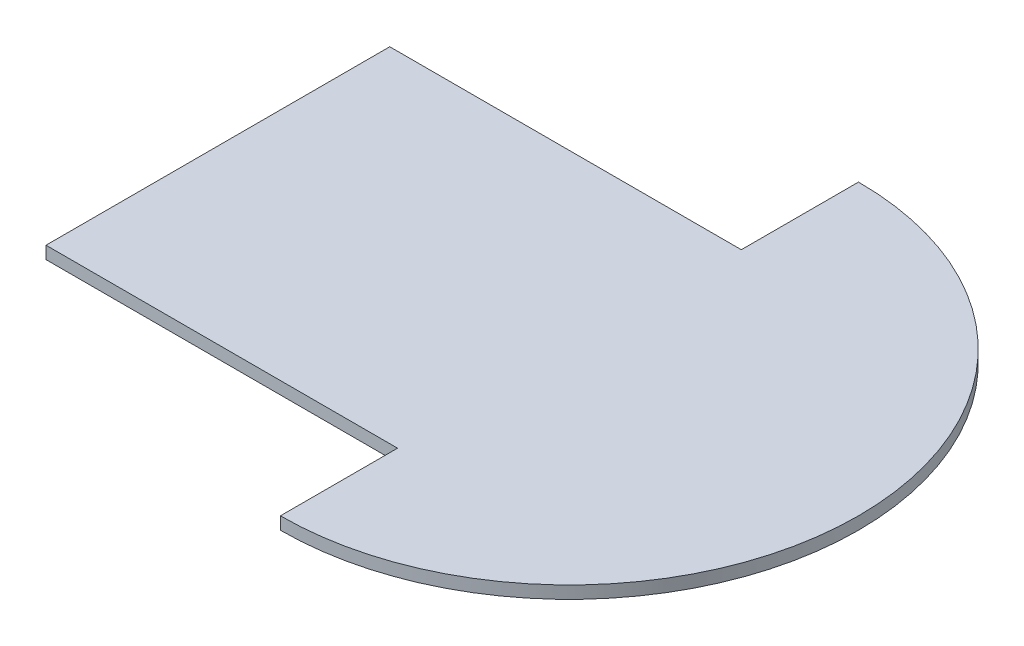
ISO-10303-21;
HEADER;
FILE_DESCRIPTION(('STEP AP214'),'2;1');
FILE_NAME('part.step','',(''),(''),'','','');
FILE_SCHEMA(('AUTOMOTIVE_DESIGN { 1 0 10303 214 1 1 1 1 }'));
ENDSEC;
DATA;
#1=APPLICATION_CONTEXT('core data for automotive mechanical design processes');
#2=APPLICATION_PROTOCOL_DEFINITION('international standard','automotive_design',2000,#1);
#3=PRODUCT_CONTEXT('',#1,'mechanical');
#4=PRODUCT('Part','Part','',(#3));
#5=PRODUCT_RELATED_PRODUCT_CATEGORY('part','',(#4));
#6=PRODUCT_DEFINITION_FORMATION('','',#4);
#7=PRODUCT_DEFINITION_CONTEXT('part definition',#1,'design');
#8=PRODUCT_DEFINITION('design','',#6,#7);
#9=PRODUCT_DEFINITION_SHAPE('','',#8);
#10=(LENGTH_UNIT() NAMED_UNIT(*) SI_UNIT(.MILLI.,.METRE.));
#11=(NAMED_UNIT(*) PLANE_ANGLE_UNIT() SI_UNIT($,.RADIAN.));
#12=(NAMED_UNIT(*) SI_UNIT($,.STERADIAN.) SOLID_ANGLE_UNIT());
#13=UNCERTAINTY_MEASURE_WITH_UNIT(LENGTH_MEASURE(1.E-05),#10,'distance_accuracy_value','');
#14=(GEOMETRIC_REPRESENTATION_CONTEXT(3) GLOBAL_UNCERTAINTY_ASSIGNED_CONTEXT((#13)) GLOBAL_UNIT_ASSIGNED_CONTEXT((#10,
#11,#12)) REPRESENTATION_CONTEXT('',''));
#15=CARTESIAN_POINT('',(0.,0.,0.));
#16=DIRECTION('',(0.,0.,1.));
#17=DIRECTION('',(1.,0.,0.));
#18=AXIS2_PLACEMENT_3D('',#15,#16,#17);
#19=CARTESIAN_POINT('',(-81.7186966651467,1.6,-33.036003586062));
#20=DIRECTION('',(0.,0.,1.));
#21=DIRECTION('',(1.,0.,0.));
#22=AXIS2_PLACEMENT_3D('',#19,#20,#21);
#23=PLANE('',#22);
#24=DIRECTION('',(-1.,0.,0.));
#25=VECTOR('',#24,1.);
#26=CARTESIAN_POINT('',(-81.7186966651467,0.,-33.036003586062));
#27=LINE('',#26,#25);
#28=CARTESIAN_POINT('',(-36.7186966651467,0.,-33.036003586062));
#29=VERTEX_POINT('',#28);
#30=CARTESIAN_POINT('',(-81.7186966651467,0.,-33.036003586062));
#31=VERTEX_POINT('',#30);
#32=EDGE_CURVE('E122',#29,#31,#27,.T.);
#33=ORIENTED_EDGE('',*,*,#32,.T.);
#34=DIRECTION('',(0.,-1.,0.));
#35=VECTOR('',#34,1.);
#36=CARTESIAN_POINT('',(-81.7186966651467,1.6,-33.036003586062));
#37=LINE('',#36,#35);
#38=CARTESIAN_POINT('',(-81.7186966651467,1.6,-33.036003586062));
#39=VERTEX_POINT('',#38);
#40=EDGE_CURVE('E11',#39,#31,#37,.T.);
#41=ORIENTED_EDGE('',*,*,#40,.F.);
#42=DIRECTION('',(-1.,0.,0.));
#43=VECTOR('',#42,1.);
#44=CARTESIAN_POINT('',(-81.7186966651467,1.6,-33.036003586062));
#45=LINE('',#44,#43);
#46=CARTESIAN_POINT('',(-36.7186966651467,1.6,-33.036003586062));
#47=VERTEX_POINT('',#46);
#48=EDGE_CURVE('E132',#47,#39,#45,.T.);
#49=ORIENTED_EDGE('',*,*,#48,.F.);
#50=DIRECTION('',(0.,-1.,0.));
#51=VECTOR('',#50,1.);
#52=CARTESIAN_POINT('',(-36.7186966651467,1.6,-33.036003586062));
#53=LINE('',#52,#51);
#54=EDGE_CURVE('E118',#47,#29,#53,.T.);
#55=ORIENTED_EDGE('',*,*,#54,.T.);
#56=EDGE_LOOP('',(#33,#41,#49,#55));
#57=FACE_BOUND('',#56,.T.);
#58=ADVANCED_FACE('F38',(#57),#23,.F.);
#59=CARTESIAN_POINT('',(-81.7186966651467,1.6,-33.036003586062));
#60=DIRECTION('',(1.,0.,0.));
#61=DIRECTION('',(0.,0.,-1.));
#62=AXIS2_PLACEMENT_3D('',#59,#60,#61);
#63=PLANE('',#62);
#64=DIRECTION('',(0.,0.,1.));
#65=VECTOR('',#64,1.);
#66=CARTESIAN_POINT('',(-81.7186966651467,0.,-33.036003586062));
#67=LINE('',#66,#65);
#68=CARTESIAN_POINT('',(-81.7186966651467,0.,10.963996413938));
#69=VERTEX_POINT('',#68);
#70=EDGE_CURVE('E125',#31,#69,#67,.T.);
#71=ORIENTED_EDGE('',*,*,#70,.T.);
#72=DIRECTION('',(0.,-1.,0.));
#73=VECTOR('',#72,1.);
#74=CARTESIAN_POINT('',(-81.7186966651467,1.6,10.963996413938));
#75=LINE('',#74,#73);
#76=CARTESIAN_POINT('',(-81.7186966651467,1.6,10.963996413938));
#77=VERTEX_POINT('',#76);
#78=EDGE_CURVE('E46',#77,#69,#75,.T.);
#79=ORIENTED_EDGE('',*,*,#78,.F.);
#80=DIRECTION('',(0.,0.,1.));
#81=VECTOR('',#80,1.);
#82=CARTESIAN_POINT('',(-81.7186966651467,1.6,-33.036003586062));
#83=LINE('',#82,#81);
#84=EDGE_CURVE('E91',#39,#77,#83,.T.);
#85=ORIENTED_EDGE('',*,*,#84,.F.);
#86=ORIENTED_EDGE('',*,*,#40,.T.);
#87=EDGE_LOOP('',(#71,#79,#85,#86));
#88=FACE_BOUND('',#87,.T.);
#89=ADVANCED_FACE('F156',(#88),#63,.F.);
#90=CARTESIAN_POINT('',(-81.7186966651467,1.6,10.963996413938));
#91=DIRECTION('',(0.,0.,-1.));
#92=DIRECTION('',(-1.,0.,0.));
#93=AXIS2_PLACEMENT_3D('',#90,#91,#92);
#94=PLANE('',#93);
#95=DIRECTION('',(1.,0.,0.));
#96=VECTOR('',#95,1.);
#97=CARTESIAN_POINT('',(-81.7186966651467,0.,10.963996413938));
#98=LINE('',#97,#96);
#99=CARTESIAN_POINT('',(-36.7186966651467,0.,10.963996413938));
#100=VERTEX_POINT('',#99);
#101=EDGE_CURVE('E127',#69,#100,#98,.T.);
#102=ORIENTED_EDGE('',*,*,#101,.T.);
#103=DIRECTION('',(0.,-1.,0.));
#104=VECTOR('',#103,1.);
#105=CARTESIAN_POINT('',(-36.7186966651467,1.6,10.963996413938));
#106=LINE('',#105,#104);
#107=CARTESIAN_POINT('',(-36.7186966651467,1.6,10.963996413938));
#108=VERTEX_POINT('',#107);
#109=EDGE_CURVE('E113',#108,#100,#106,.T.);
#110=ORIENTED_EDGE('',*,*,#109,.F.);
#111=DIRECTION('',(1.,0.,0.));
#112=VECTOR('',#111,1.);
#113=CARTESIAN_POINT('',(-81.7186966651467,1.6,10.963996413938));
#114=LINE('',#113,#112);
#115=EDGE_CURVE('E104',#77,#108,#114,.T.);
#116=ORIENTED_EDGE('',*,*,#115,.F.);
#117=ORIENTED_EDGE('',*,*,#78,.T.);
#118=EDGE_LOOP('',(#102,#110,#116,#117));
#119=FACE_BOUND('',#118,.T.);
#120=ADVANCED_FACE('F138',(#119),#94,.F.);
#121=CARTESIAN_POINT('',(-36.7186966651467,1.6,10.963996413938));
#122=DIRECTION('',(1.,0.,0.));
#123=DIRECTION('',(0.,0.,-1.));
#124=AXIS2_PLACEMENT_3D('',#121,#122,#123);
#125=PLANE('',#124);
#126=DIRECTION('',(0.,0.,1.));
#127=VECTOR('',#126,1.);
#128=CARTESIAN_POINT('',(-36.7186966651467,0.,10.963996413938));
#129=LINE('',#128,#127);
#130=CARTESIAN_POINT('',(-36.7186966651467,0.,25.963996413938));
#131=VERTEX_POINT('',#130);
#132=EDGE_CURVE('E112',#100,#131,#129,.T.);
#133=ORIENTED_EDGE('',*,*,#132,.T.);
#134=DIRECTION('',(0.,-1.,0.));
#135=VECTOR('',#134,1.);
#136=CARTESIAN_POINT('',(-36.7186966651467,1.6,25.963996413938));
#137=LINE('',#136,#135);
#138=CARTESIAN_POINT('',(-36.7186966651467,1.6,25.963996413938));
#139=VERTEX_POINT('',#138);
#140=EDGE_CURVE('E109',#139,#131,#137,.T.);
#141=ORIENTED_EDGE('',*,*,#140,.F.);
#142=DIRECTION('',(0.,0.,1.));
#143=VECTOR('',#142,1.);
#144=CARTESIAN_POINT('',(-36.7186966651467,1.6,10.963996413938));
#145=LINE('',#144,#143);
#146=EDGE_CURVE('E98',#108,#139,#145,.T.);
#147=ORIENTED_EDGE('',*,*,#146,.F.);
#148=ORIENTED_EDGE('',*,*,#109,.T.);
#149=EDGE_LOOP('',(#133,#141,#147,#148));
#150=FACE_BOUND('',#149,.T.);
#151=ADVANCED_FACE('F110',(#150),#125,.F.);
#152=CARTESIAN_POINT('',(-36.7186966651467,1.6,-11.036003586062));
#153=DIRECTION('',(0.,-1.,0.));
#154=DIRECTION('',(0.,0.,-1.));
#155=AXIS2_PLACEMENT_3D('',#152,#153,#154);
#156=CYLINDRICAL_SURFACE('',#155,37.);
#157=CARTESIAN_POINT('',(-36.7186966651467,0.,-11.036003586062));
#158=DIRECTION('',(0.,1.,0.));
#159=DIRECTION('',(0.,0.,-1.));
#160=AXIS2_PLACEMENT_3D('',#157,#158,#159);
#161=CIRCLE('',#160,37.);
#162=CARTESIAN_POINT('',(-36.7186966651467,0.,-48.036003586062));
#163=VERTEX_POINT('',#162);
#164=EDGE_CURVE('E77',#131,#163,#161,.T.);
#165=ORIENTED_EDGE('',*,*,#164,.T.);
#166=DIRECTION('',(0.,-1.,0.));
#167=VECTOR('',#166,1.);
#168=CARTESIAN_POINT('',(-36.7186966651467,1.6,-48.036003586062));
#169=LINE('',#168,#167);
#170=CARTESIAN_POINT('',(-36.7186966651467,1.6,-48.036003586062));
#171=VERTEX_POINT('',#170);
#172=EDGE_CURVE('E114',#171,#163,#169,.T.);
#173=ORIENTED_EDGE('',*,*,#172,.F.);
#174=CARTESIAN_POINT('',(-36.7186966651467,1.6,-11.036003586062));
#175=DIRECTION('',(0.,1.,0.));
#176=DIRECTION('',(0.,0.,-1.));
#177=AXIS2_PLACEMENT_3D('',#174,#175,#176);
#178=CIRCLE('',#177,37.);
#179=EDGE_CURVE('E102',#139,#171,#178,.T.);
#180=ORIENTED_EDGE('',*,*,#179,.F.);
#181=ORIENTED_EDGE('',*,*,#140,.T.);
#182=EDGE_LOOP('',(#165,#173,#180,#181));
#183=FACE_BOUND('',#182,.T.);
#184=ADVANCED_FACE('F116',(#183),#156,.T.);
#185=CARTESIAN_POINT('',(-36.7186966651467,1.6,-33.036003586062));
#186=DIRECTION('',(1.,0.,0.));
#187=DIRECTION('',(0.,0.,-1.));
#188=AXIS2_PLACEMENT_3D('',#185,#186,#187);
#189=PLANE('',#188);
#190=DIRECTION('',(0.,0.,1.));
#191=VECTOR('',#190,1.);
#192=CARTESIAN_POINT('',(-36.7186966651467,0.,-33.036003586062));
#193=LINE('',#192,#191);
#194=EDGE_CURVE('E83',#163,#29,#193,.T.);
#195=ORIENTED_EDGE('',*,*,#194,.T.);
#196=ORIENTED_EDGE('',*,*,#54,.F.);
#197=DIRECTION('',(0.,0.,1.));
#198=VECTOR('',#197,1.);
#199=CARTESIAN_POINT('',(-36.7186966651467,1.6,-33.036003586062));
#200=LINE('',#199,#198);
#201=EDGE_CURVE('E54',#171,#47,#200,.T.);
#202=ORIENTED_EDGE('',*,*,#201,.F.);
#203=ORIENTED_EDGE('',*,*,#172,.T.);
#204=EDGE_LOOP('',(#195,#196,#202,#203));
#205=FACE_BOUND('',#204,.T.);
#206=ADVANCED_FACE('F145',(#205),#189,.F.);
#207=CARTESIAN_POINT('',(-36.7186966651467,1.6,-11.036003586062));
#208=DIRECTION('',(0.,-1.,0.));
#209=DIRECTION('',(0.,0.,-1.));
#210=AXIS2_PLACEMENT_3D('',#207,#208,#209);
#211=PLANE('',#210);
#212=ORIENTED_EDGE('',*,*,#48,.T.);
#213=ORIENTED_EDGE('',*,*,#84,.T.);
#214=ORIENTED_EDGE('',*,*,#115,.T.);
#215=ORIENTED_EDGE('',*,*,#146,.T.);
#216=ORIENTED_EDGE('',*,*,#179,.T.);
#217=ORIENTED_EDGE('',*,*,#201,.T.);
#218=EDGE_LOOP('',(#212,#213,#214,#215,#216,#217));
#219=FACE_BOUND('',#218,.T.);
#220=ADVANCED_FACE('F100',(#219),#211,.F.);
#221=CARTESIAN_POINT('',(-36.7186966651467,0.,-11.036003586062));
#222=DIRECTION('',(0.,-1.,0.));
#223=DIRECTION('',(0.,0.,-1.));
#224=AXIS2_PLACEMENT_3D('',#221,#222,#223);
#225=PLANE('',#224);
#226=ORIENTED_EDGE('',*,*,#32,.F.);
#227=ORIENTED_EDGE('',*,*,#194,.F.);
#228=ORIENTED_EDGE('',*,*,#164,.F.);
#229=ORIENTED_EDGE('',*,*,#132,.F.);
#230=ORIENTED_EDGE('',*,*,#101,.F.);
#231=ORIENTED_EDGE('',*,*,#70,.F.);
#232=EDGE_LOOP('',(#226,#227,#228,#229,#230,#231));
#233=FACE_BOUND('',#232,.T.);
#234=ADVANCED_FACE('F141',(#233),#225,.T.);
#235=CLOSED_SHELL('',(#58,#89,#120,#151,#184,#206,#220,#234));
#236=MANIFOLD_SOLID_BREP('B2',#235);
#237=ADVANCED_BREP_SHAPE_REPRESENTATION('',(#18,#236),#14);
#238=SHAPE_DEFINITION_REPRESENTATION(#9,#237);
ENDSEC;
END-ISO-10303-21;
